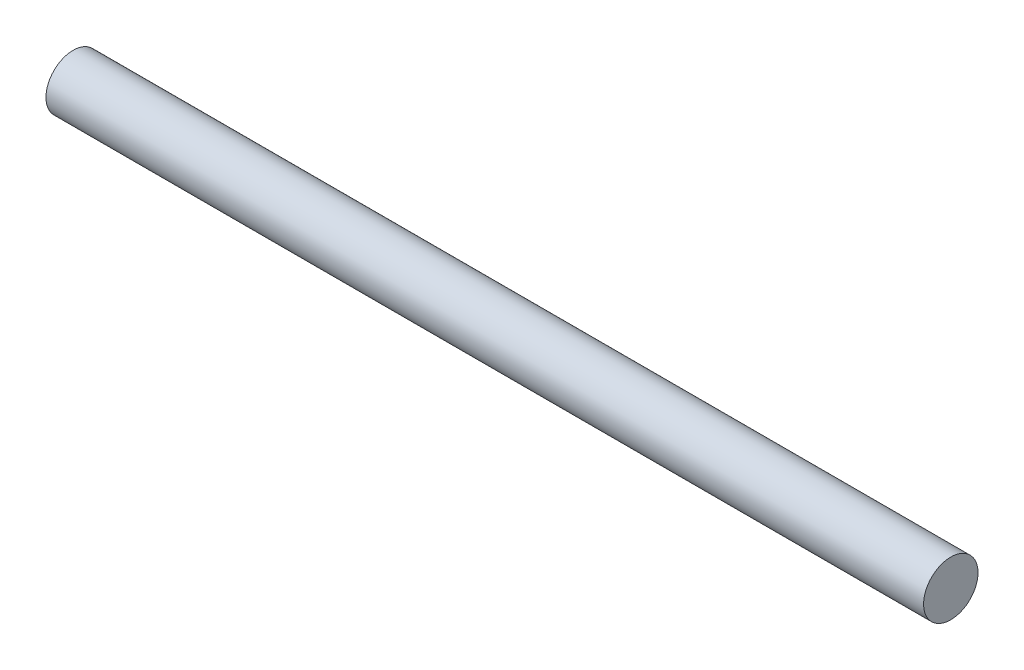
ISO-10303-21;
HEADER;
FILE_DESCRIPTION(('STEP AP214'),'2;1');
FILE_NAME('part.step','',(''),(''),'','','');
FILE_SCHEMA(('AUTOMOTIVE_DESIGN { 1 0 10303 214 1 1 1 1 }'));
ENDSEC;
DATA;
#1=APPLICATION_CONTEXT('core data for automotive mechanical design processes');
#2=APPLICATION_PROTOCOL_DEFINITION('international standard','automotive_design',2000,#1);
#3=PRODUCT_CONTEXT('',#1,'mechanical');
#4=PRODUCT('Part','Part','',(#3));
#5=PRODUCT_RELATED_PRODUCT_CATEGORY('part','',(#4));
#6=PRODUCT_DEFINITION_FORMATION('','',#4);
#7=PRODUCT_DEFINITION_CONTEXT('part definition',#1,'design');
#8=PRODUCT_DEFINITION('design','',#6,#7);
#9=PRODUCT_DEFINITION_SHAPE('','',#8);
#10=(LENGTH_UNIT() NAMED_UNIT(*) SI_UNIT(.MILLI.,.METRE.));
#11=(NAMED_UNIT(*) PLANE_ANGLE_UNIT() SI_UNIT($,.RADIAN.));
#12=(NAMED_UNIT(*) SI_UNIT($,.STERADIAN.) SOLID_ANGLE_UNIT());
#13=UNCERTAINTY_MEASURE_WITH_UNIT(LENGTH_MEASURE(1.E-05),#10,'distance_accuracy_value','');
#14=(GEOMETRIC_REPRESENTATION_CONTEXT(3) GLOBAL_UNCERTAINTY_ASSIGNED_CONTEXT((#13)) GLOBAL_UNIT_ASSIGNED_CONTEXT((#10,
#11,#12)) REPRESENTATION_CONTEXT('',''));
#15=CARTESIAN_POINT('',(0.,0.,0.));
#16=DIRECTION('',(0.,0.,1.));
#17=DIRECTION('',(1.,0.,0.));
#18=AXIS2_PLACEMENT_3D('',#15,#16,#17);
#19=CARTESIAN_POINT('',(129.,0.,0.));
#20=DIRECTION('',(-1.,0.,0.));
#21=DIRECTION('',(0.,0.,1.));
#22=AXIS2_PLACEMENT_3D('',#19,#20,#21);
#23=CYLINDRICAL_SURFACE('',#22,4.);
#24=CARTESIAN_POINT('',(129.,0.,0.));
#25=DIRECTION('',(1.,0.,0.));
#26=DIRECTION('',(0.,0.,-1.));
#27=AXIS2_PLACEMENT_3D('',#24,#25,#26);
#28=CIRCLE('',#27,4.);
#29=CARTESIAN_POINT('',(129.,0.,-4.));
#30=VERTEX_POINT('',#29);
#31=EDGE_CURVE('E10',#30,#30,#28,.T.);
#32=ORIENTED_EDGE('',*,*,#31,.F.);
#33=EDGE_LOOP('',(#32));
#34=FACE_BOUND('',#33,.T.);
#35=CARTESIAN_POINT('',(0.,0.,0.));
#36=DIRECTION('',(1.,0.,0.));
#37=DIRECTION('',(0.,0.,-1.));
#38=AXIS2_PLACEMENT_3D('',#35,#36,#37);
#39=CIRCLE('',#38,4.);
#40=CARTESIAN_POINT('',(0.,0.,-4.));
#41=VERTEX_POINT('',#40);
#42=EDGE_CURVE('E36',#41,#41,#39,.T.);
#43=ORIENTED_EDGE('',*,*,#42,.T.);
#44=EDGE_LOOP('',(#43));
#45=FACE_BOUND('',#44,.T.);
#46=ADVANCED_FACE('F33',(#34,#45),#23,.T.);
#47=CARTESIAN_POINT('',(129.,0.,0.));
#48=DIRECTION('',(1.,0.,0.));
#49=DIRECTION('',(0.,0.,-1.));
#50=AXIS2_PLACEMENT_3D('',#47,#48,#49);
#51=PLANE('',#50);
#52=ORIENTED_EDGE('',*,*,#31,.T.);
#53=EDGE_LOOP('',(#52));
#54=FACE_BOUND('',#53,.T.);
#55=ADVANCED_FACE('F48',(#54),#51,.T.);
#56=CARTESIAN_POINT('',(0.,0.,0.));
#57=DIRECTION('',(1.,0.,0.));
#58=DIRECTION('',(0.,0.,-1.));
#59=AXIS2_PLACEMENT_3D('',#56,#57,#58);
#60=PLANE('',#59);
#61=ORIENTED_EDGE('',*,*,#42,.F.);
#62=EDGE_LOOP('',(#61));
#63=FACE_BOUND('',#62,.T.);
#64=ADVANCED_FACE('F46',(#63),#60,.F.);
#65=CLOSED_SHELL('',(#46,#55,#64));
#66=MANIFOLD_SOLID_BREP('B2',#65);
#67=ADVANCED_BREP_SHAPE_REPRESENTATION('',(#18,#66),#14);
#68=SHAPE_DEFINITION_REPRESENTATION(#9,#67);
ENDSEC;
END-ISO-10303-21;
